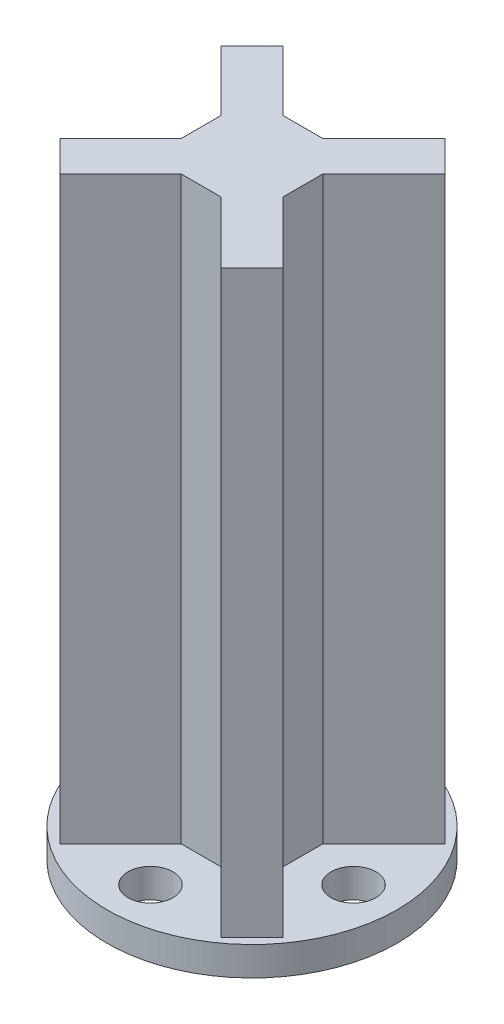
ISO-10303-21;
HEADER;
FILE_DESCRIPTION(('STEP AP214'),'2;1');
FILE_NAME('part.step','',(''),(''),'','','');
FILE_SCHEMA(('AUTOMOTIVE_DESIGN { 1 0 10303 214 1 1 1 1 }'));
ENDSEC;
DATA;
#1=APPLICATION_CONTEXT('core data for automotive mechanical design processes');
#2=APPLICATION_PROTOCOL_DEFINITION('international standard','automotive_design',2000,#1);
#3=PRODUCT_CONTEXT('',#1,'mechanical');
#4=PRODUCT('Part','Part','',(#3));
#5=PRODUCT_RELATED_PRODUCT_CATEGORY('part','',(#4));
#6=PRODUCT_DEFINITION_FORMATION('','',#4);
#7=PRODUCT_DEFINITION_CONTEXT('part definition',#1,'design');
#8=PRODUCT_DEFINITION('design','',#6,#7);
#9=PRODUCT_DEFINITION_SHAPE('','',#8);
#10=(LENGTH_UNIT() NAMED_UNIT(*) SI_UNIT(.MILLI.,.METRE.));
#11=(NAMED_UNIT(*) PLANE_ANGLE_UNIT() SI_UNIT($,.RADIAN.));
#12=(NAMED_UNIT(*) SI_UNIT($,.STERADIAN.) SOLID_ANGLE_UNIT());
#13=UNCERTAINTY_MEASURE_WITH_UNIT(LENGTH_MEASURE(1.E-05),#10,'distance_accuracy_value','');
#14=(GEOMETRIC_REPRESENTATION_CONTEXT(3) GLOBAL_UNCERTAINTY_ASSIGNED_CONTEXT((#13)) GLOBAL_UNIT_ASSIGNED_CONTEXT((#10,
#11,#12)) REPRESENTATION_CONTEXT('',''));
#15=CARTESIAN_POINT('',(0.,0.,0.));
#16=DIRECTION('',(0.,0.,1.));
#17=DIRECTION('',(1.,0.,0.));
#18=AXIS2_PLACEMENT_3D('',#15,#16,#17);
#19=CARTESIAN_POINT('',(0.,-19.,20.99999999999));
#20=DIRECTION('',(0.,1.,5.26164181668953E-13));
#21=DIRECTION('',(1.,0.,0.));
#22=AXIS2_PLACEMENT_3D('',#19,#20,#21);
#23=PLANE('',#22);
#24=DIRECTION('',(0.707106781186547,-3.72054260875587E-13,0.707106781186547));
#25=VECTOR('',#24,1.);
#26=CARTESIAN_POINT('',(3.5,-19.0000000000008,22.3786796564304));
#27=LINE('',#26,#25);
#28=CARTESIAN_POINT('',(3.5,-19.0000000000008,22.3786796564304));
#29=VERTEX_POINT('',#28);
#30=CARTESIAN_POINT('',(7.72465485548361,-19.000000000003,26.603334511914));
#31=VERTEX_POINT('',#30);
#32=EDGE_CURVE('E203',#29,#31,#27,.T.);
#33=ORIENTED_EDGE('',*,*,#32,.T.);
#34=DIRECTION('',(0.707106781186548,3.72054260875587E-13,-0.707106781186547));
#35=VECTOR('',#34,1.);
#36=CARTESIAN_POINT('',(5.60333451192397,-19.0000000000041,28.7246548554736));
#37=LINE('',#36,#35);
#38=CARTESIAN_POINT('',(5.60333451192397,-19.0000000000041,28.7246548554736));
#39=VERTEX_POINT('',#38);
#40=EDGE_CURVE('E207',#39,#31,#37,.T.);
#41=ORIENTED_EDGE('',*,*,#40,.F.);
#42=DIRECTION('',(0.707106781186548,-3.72054260875587E-13,0.707106781186547));
#43=VECTOR('',#42,1.);
#44=CARTESIAN_POINT('',(1.37867965644036,-19.0000000000019,24.49999999999));
#45=LINE('',#44,#43);
#46=CARTESIAN_POINT('',(1.37867965644036,-19.0000000000019,24.49999999999));
#47=VERTEX_POINT('',#46);
#48=EDGE_CURVE('E210',#47,#39,#45,.T.);
#49=ORIENTED_EDGE('',*,*,#48,.F.);
#50=DIRECTION('',(1.,0.,0.));
#51=VECTOR('',#50,1.);
#52=CARTESIAN_POINT('',(-1.37867965644036,-19.0000000000019,24.49999999999));
#53=LINE('',#52,#51);
#54=CARTESIAN_POINT('',(-1.37867965644036,-19.0000000000019,24.49999999999));
#55=VERTEX_POINT('',#54);
#56=EDGE_CURVE('E213',#55,#47,#53,.T.);
#57=ORIENTED_EDGE('',*,*,#56,.F.);
#58=DIRECTION('',(-0.707106781186548,-3.72054260875587E-13,0.707106781186548));
#59=VECTOR('',#58,1.);
#60=CARTESIAN_POINT('',(-1.37867965644036,-19.0000000000019,24.49999999999));
#61=LINE('',#60,#59);
#62=CARTESIAN_POINT('',(-5.56201766710437,-19.0000000000041,28.683338010654));
#63=VERTEX_POINT('',#62);
#64=EDGE_CURVE('E216',#55,#63,#61,.T.);
#65=ORIENTED_EDGE('',*,*,#64,.T.);
#66=DIRECTION('',(0.707106781186547,-3.72054260875587E-13,0.707106781186547));
#67=VECTOR('',#66,1.);
#68=CARTESIAN_POINT('',(-7.68333801066402,-19.000000000003,26.5620176670944));
#69=LINE('',#68,#67);
#70=CARTESIAN_POINT('',(-7.68333801066402,-19.000000000003,26.5620176670944));
#71=VERTEX_POINT('',#70);
#72=EDGE_CURVE('E220',#71,#63,#69,.T.);
#73=ORIENTED_EDGE('',*,*,#72,.F.);
#74=DIRECTION('',(-0.707106781186547,-3.72054260875587E-13,0.707106781186547));
#75=VECTOR('',#74,1.);
#76=CARTESIAN_POINT('',(-3.5,-19.0000000000008,22.3786796564304));
#77=LINE('',#76,#75);
#78=CARTESIAN_POINT('',(-3.5,-19.0000000000008,22.3786796564304));
#79=VERTEX_POINT('',#78);
#80=EDGE_CURVE('E224',#79,#71,#77,.T.);
#81=ORIENTED_EDGE('',*,*,#80,.F.);
#82=DIRECTION('',(0.,5.26164181668953E-13,-1.));
#83=VECTOR('',#82,1.);
#84=CARTESIAN_POINT('',(-3.5,-19.0000000000008,22.3786796564304));
#85=LINE('',#84,#83);
#86=CARTESIAN_POINT('',(-3.5,-18.9999999999993,19.6213203435496));
#87=VERTEX_POINT('',#86);
#88=EDGE_CURVE('E227',#79,#87,#85,.T.);
#89=ORIENTED_EDGE('',*,*,#88,.T.);
#90=DIRECTION('',(-0.707106781186547,3.72054260875587E-13,-0.707106781186547));
#91=VECTOR('',#90,1.);
#92=CARTESIAN_POINT('',(-3.5,-18.9999999999993,19.6213203435496));
#93=LINE('',#92,#91);
#94=CARTESIAN_POINT('',(-7.6416597328646,-18.9999999999971,15.479660610685));
#95=VERTEX_POINT('',#94);
#96=EDGE_CURVE('E231',#87,#95,#93,.T.);
#97=ORIENTED_EDGE('',*,*,#96,.T.);
#98=DIRECTION('',(-0.707106781186548,-3.72054260875587E-13,0.707106781186547));
#99=VECTOR('',#98,1.);
#100=CARTESIAN_POINT('',(-5.52033938930496,-18.999999999996,13.3583402671254));
#101=LINE('',#100,#99);
#102=CARTESIAN_POINT('',(-5.52033938930496,-18.999999999996,13.3583402671254));
#103=VERTEX_POINT('',#102);
#104=EDGE_CURVE('E235',#103,#95,#101,.T.);
#105=ORIENTED_EDGE('',*,*,#104,.F.);
#106=DIRECTION('',(-0.707106781186547,3.72054260875587E-13,-0.707106781186547));
#107=VECTOR('',#106,1.);
#108=CARTESIAN_POINT('',(-1.37867965644036,-18.9999999999982,17.49999999999));
#109=LINE('',#108,#107);
#110=CARTESIAN_POINT('',(-1.37867965644036,-18.9999999999982,17.49999999999));
#111=VERTEX_POINT('',#110);
#112=EDGE_CURVE('E239',#111,#103,#109,.T.);
#113=ORIENTED_EDGE('',*,*,#112,.F.);
#114=DIRECTION('',(1.,0.,0.));
#115=VECTOR('',#114,1.);
#116=CARTESIAN_POINT('',(-1.37867965644036,-18.9999999999982,17.49999999999));
#117=LINE('',#116,#115);
#118=CARTESIAN_POINT('',(1.37867965644036,-18.9999999999982,17.49999999999));
#119=VERTEX_POINT('',#118);
#120=EDGE_CURVE('E242',#111,#119,#117,.T.);
#121=ORIENTED_EDGE('',*,*,#120,.T.);
#122=DIRECTION('',(0.707106781186548,3.72054260875587E-13,-0.707106781186548));
#123=VECTOR('',#122,1.);
#124=CARTESIAN_POINT('',(1.37867965644036,-18.9999999999982,17.49999999999));
#125=LINE('',#124,#123);
#126=CARTESIAN_POINT('',(5.58465948915064,-18.999999999996,13.2940201672797));
#127=VERTEX_POINT('',#126);
#128=EDGE_CURVE('E246',#119,#127,#125,.T.);
#129=ORIENTED_EDGE('',*,*,#128,.T.);
#130=DIRECTION('',(0.707106781186548,-3.72054260875587E-13,0.707106781186548));
#131=VECTOR('',#130,1.);
#132=CARTESIAN_POINT('',(5.58465948915064,-18.999999999996,13.2940201672797));
#133=LINE('',#132,#131);
#134=CARTESIAN_POINT('',(7.70597983271028,-18.9999999999971,15.4153405108394));
#135=VERTEX_POINT('',#134);
#136=EDGE_CURVE('E250',#127,#135,#133,.T.);
#137=ORIENTED_EDGE('',*,*,#136,.T.);
#138=DIRECTION('',(0.707106781186547,3.72054260875587E-13,-0.707106781186548));
#139=VECTOR('',#138,1.);
#140=CARTESIAN_POINT('',(3.5,-18.9999999999993,19.6213203435496));
#141=LINE('',#140,#139);
#142=CARTESIAN_POINT('',(3.5,-18.9999999999993,19.6213203435496));
#143=VERTEX_POINT('',#142);
#144=EDGE_CURVE('E183',#143,#135,#141,.T.);
#145=ORIENTED_EDGE('',*,*,#144,.F.);
#146=DIRECTION('',(0.,5.26164181668953E-13,-1.));
#147=VECTOR('',#146,1.);
#148=CARTESIAN_POINT('',(3.5,-19.0000000000008,22.3786796564304));
#149=LINE('',#148,#147);
#150=EDGE_CURVE('E255',#29,#143,#149,.T.);
#151=ORIENTED_EDGE('',*,*,#150,.F.);
#152=EDGE_LOOP('',(#33,#41,#49,#57,#65,#73,#81,#89,#97,#105,#113,#121,#129,#137,#145,#151));
#153=FACE_BOUND('',#152,.T.);
#154=CARTESIAN_POINT('',(0.,-19.0000000000037,27.99999999999));
#155=DIRECTION('',(0.,1.,5.26164181668953E-13));
#156=DIRECTION('',(1.,0.,0.));
#157=AXIS2_PLACEMENT_3D('',#154,#155,#156);
#158=CIRCLE('',#157,1.55);
#159=CARTESIAN_POINT('',(1.55,-19.0000000000037,27.99999999999));
#160=VERTEX_POINT('',#159);
#161=EDGE_CURVE('E311',#160,#160,#158,.T.);
#162=ORIENTED_EDGE('',*,*,#161,.F.);
#163=EDGE_LOOP('',(#162));
#164=FACE_BOUND('',#163,.T.);
#165=CARTESIAN_POINT('',(0.,-18.9999999999964,13.99999999999));
#166=DIRECTION('',(0.,1.,5.26164181668953E-13));
#167=DIRECTION('',(1.,0.,0.));
#168=AXIS2_PLACEMENT_3D('',#165,#166,#167);
#169=CIRCLE('',#168,1.55);
#170=CARTESIAN_POINT('',(1.55,-18.9999999999964,13.99999999999));
#171=VERTEX_POINT('',#170);
#172=EDGE_CURVE('E327',#171,#171,#169,.T.);
#173=ORIENTED_EDGE('',*,*,#172,.F.);
#174=EDGE_LOOP('',(#173));
#175=FACE_BOUND('',#174,.T.);
#176=CARTESIAN_POINT('',(0.,-19.,20.99999999999));
#177=DIRECTION('',(0.,1.,5.26164181668953E-13));
#178=DIRECTION('',(1.,0.,0.));
#179=AXIS2_PLACEMENT_3D('',#176,#177,#178);
#180=CIRCLE('',#179,10.);
#181=CARTESIAN_POINT('',(10.,-19.,20.99999999999));
#182=VERTEX_POINT('',#181);
#183=EDGE_CURVE('E11',#182,#182,#180,.T.);
#184=ORIENTED_EDGE('',*,*,#183,.T.);
#185=EDGE_LOOP('',(#184));
#186=FACE_BOUND('',#185,.T.);
#187=CARTESIAN_POINT('',(-7.,-19.,20.99999999999));
#188=DIRECTION('',(0.,1.,5.26164181668953E-13));
#189=DIRECTION('',(1.,0.,0.));
#190=AXIS2_PLACEMENT_3D('',#187,#188,#189);
#191=CIRCLE('',#190,1.55);
#192=CARTESIAN_POINT('',(-5.45,-19.,20.99999999999));
#193=VERTEX_POINT('',#192);
#194=EDGE_CURVE('E319',#193,#193,#191,.T.);
#195=ORIENTED_EDGE('',*,*,#194,.F.);
#196=EDGE_LOOP('',(#195));
#197=FACE_BOUND('',#196,.T.);
#198=CARTESIAN_POINT('',(7.,-19.,20.99999999999));
#199=DIRECTION('',(0.,1.,5.26164181668953E-13));
#200=DIRECTION('',(1.,0.,0.));
#201=AXIS2_PLACEMENT_3D('',#198,#199,#200);
#202=CIRCLE('',#201,1.55);
#203=CARTESIAN_POINT('',(8.55,-19.,20.99999999999));
#204=VERTEX_POINT('',#203);
#205=EDGE_CURVE('E303',#204,#204,#202,.T.);
#206=ORIENTED_EDGE('',*,*,#205,.F.);
#207=EDGE_LOOP('',(#206));
#208=FACE_BOUND('',#207,.T.);
#209=ADVANCED_FACE('F45',(#153,#164,#175,#186,#197,#208),#23,.T.);
#210=CARTESIAN_POINT('',(0.,-21.,20.9999999999889));
#211=DIRECTION('',(0.,1.,5.26164181668953E-13));
#212=DIRECTION('',(1.,0.,0.));
#213=AXIS2_PLACEMENT_3D('',#210,#211,#212);
#214=PLANE('',#213);
#215=CARTESIAN_POINT('',(0.,-21.,20.9999999999889));
#216=DIRECTION('',(0.,1.,5.26164181668953E-13));
#217=DIRECTION('',(1.,0.,0.));
#218=AXIS2_PLACEMENT_3D('',#215,#216,#217);
#219=CIRCLE('',#218,10.);
#220=CARTESIAN_POINT('',(10.,-21.,20.9999999999889));
#221=VERTEX_POINT('',#220);
#222=EDGE_CURVE('E49',#221,#221,#219,.T.);
#223=ORIENTED_EDGE('',*,*,#222,.F.);
#224=EDGE_LOOP('',(#223));
#225=FACE_BOUND('',#224,.T.);
#226=CARTESIAN_POINT('',(0.,-20.9999999999963,13.9999999999889));
#227=DIRECTION('',(0.,1.,5.26164181668953E-13));
#228=DIRECTION('',(1.,0.,0.));
#229=AXIS2_PLACEMENT_3D('',#226,#227,#228);
#230=CIRCLE('',#229,1.55);
#231=CARTESIAN_POINT('',(1.55,-20.9999999999963,13.9999999999889));
#232=VERTEX_POINT('',#231);
#233=EDGE_CURVE('E323',#232,#232,#230,.T.);
#234=ORIENTED_EDGE('',*,*,#233,.T.);
#235=EDGE_LOOP('',(#234));
#236=FACE_BOUND('',#235,.T.);
#237=CARTESIAN_POINT('',(-7.,-21.,20.999999999989));
#238=DIRECTION('',(0.,1.,5.26164181668953E-13));
#239=DIRECTION('',(1.,0.,0.));
#240=AXIS2_PLACEMENT_3D('',#237,#238,#239);
#241=CIRCLE('',#240,1.55);
#242=CARTESIAN_POINT('',(-5.45,-21.,20.999999999989));
#243=VERTEX_POINT('',#242);
#244=EDGE_CURVE('E315',#243,#243,#241,.T.);
#245=ORIENTED_EDGE('',*,*,#244,.T.);
#246=EDGE_LOOP('',(#245));
#247=FACE_BOUND('',#246,.T.);
#248=CARTESIAN_POINT('',(0.,-21.0000000000037,27.9999999999889));
#249=DIRECTION('',(0.,1.,5.26164181668953E-13));
#250=DIRECTION('',(1.,0.,0.));
#251=AXIS2_PLACEMENT_3D('',#248,#249,#250);
#252=CIRCLE('',#251,1.55);
#253=CARTESIAN_POINT('',(1.55,-21.0000000000037,27.9999999999889));
#254=VERTEX_POINT('',#253);
#255=EDGE_CURVE('E307',#254,#254,#252,.T.);
#256=ORIENTED_EDGE('',*,*,#255,.T.);
#257=EDGE_LOOP('',(#256));
#258=FACE_BOUND('',#257,.T.);
#259=CARTESIAN_POINT('',(7.,-21.,20.9999999999889));
#260=DIRECTION('',(0.,1.,5.26164181668953E-13));
#261=DIRECTION('',(1.,0.,0.));
#262=AXIS2_PLACEMENT_3D('',#259,#260,#261);
#263=CIRCLE('',#262,1.55);
#264=CARTESIAN_POINT('',(8.55,-21.,20.9999999999889));
#265=VERTEX_POINT('',#264);
#266=EDGE_CURVE('E261',#265,#265,#263,.T.);
#267=ORIENTED_EDGE('',*,*,#266,.T.);
#268=EDGE_LOOP('',(#267));
#269=FACE_BOUND('',#268,.T.);
#270=ADVANCED_FACE('F335',(#225,#236,#247,#258,#269),#214,.F.);
#271=CARTESIAN_POINT('',(0.,-19.,20.99999999999));
#272=DIRECTION('',(0.,-1.,-5.26164181668953E-13));
#273=DIRECTION('',(-1.,0.,0.));
#274=AXIS2_PLACEMENT_3D('',#271,#272,#273);
#275=CYLINDRICAL_SURFACE('',#274,10.);
#276=ORIENTED_EDGE('',*,*,#183,.F.);
#277=EDGE_LOOP('',(#276));
#278=FACE_BOUND('',#277,.T.);
#279=ORIENTED_EDGE('',*,*,#222,.T.);
#280=EDGE_LOOP('',(#279));
#281=FACE_BOUND('',#280,.T.);
#282=ADVANCED_FACE('F47',(#278,#281),#275,.T.);
#283=CARTESIAN_POINT('',(0.,-18.9999999999964,13.99999999999));
#284=DIRECTION('',(0.,-1.,-5.26164181668953E-13));
#285=DIRECTION('',(-1.,0.,0.));
#286=AXIS2_PLACEMENT_3D('',#283,#284,#285);
#287=CYLINDRICAL_SURFACE('',#286,1.55);
#288=ORIENTED_EDGE('',*,*,#172,.T.);
#289=EDGE_LOOP('',(#288));
#290=FACE_BOUND('',#289,.T.);
#291=ORIENTED_EDGE('',*,*,#233,.F.);
#292=EDGE_LOOP('',(#291));
#293=FACE_BOUND('',#292,.T.);
#294=ADVANCED_FACE('F338',(#290,#293),#287,.F.);
#295=CARTESIAN_POINT('',(-7.,-19.,20.99999999999));
#296=DIRECTION('',(0.,-1.,-5.26164181668953E-13));
#297=DIRECTION('',(-1.,0.,0.));
#298=AXIS2_PLACEMENT_3D('',#295,#296,#297);
#299=CYLINDRICAL_SURFACE('',#298,1.55);
#300=ORIENTED_EDGE('',*,*,#194,.T.);
#301=EDGE_LOOP('',(#300));
#302=FACE_BOUND('',#301,.T.);
#303=ORIENTED_EDGE('',*,*,#244,.F.);
#304=EDGE_LOOP('',(#303));
#305=FACE_BOUND('',#304,.T.);
#306=ADVANCED_FACE('F340',(#302,#305),#299,.F.);
#307=CARTESIAN_POINT('',(0.,-19.0000000000037,27.99999999999));
#308=DIRECTION('',(0.,-1.,-5.26164181668953E-13));
#309=DIRECTION('',(-1.,0.,0.));
#310=AXIS2_PLACEMENT_3D('',#307,#308,#309);
#311=CYLINDRICAL_SURFACE('',#310,1.55);
#312=ORIENTED_EDGE('',*,*,#161,.T.);
#313=EDGE_LOOP('',(#312));
#314=FACE_BOUND('',#313,.T.);
#315=ORIENTED_EDGE('',*,*,#255,.F.);
#316=EDGE_LOOP('',(#315));
#317=FACE_BOUND('',#316,.T.);
#318=ADVANCED_FACE('F347',(#314,#317),#311,.F.);
#319=CARTESIAN_POINT('',(7.,-19.,20.99999999999));
#320=DIRECTION('',(0.,-1.,-5.26164181668953E-13));
#321=DIRECTION('',(-1.,0.,0.));
#322=AXIS2_PLACEMENT_3D('',#319,#320,#321);
#323=CYLINDRICAL_SURFACE('',#322,1.55);
#324=ORIENTED_EDGE('',*,*,#205,.T.);
#325=EDGE_LOOP('',(#324));
#326=FACE_BOUND('',#325,.T.);
#327=ORIENTED_EDGE('',*,*,#266,.F.);
#328=EDGE_LOOP('',(#327));
#329=FACE_BOUND('',#328,.T.);
#330=ADVANCED_FACE('F371',(#326,#329),#323,.F.);
#331=CARTESIAN_POINT('',(3.5,20.9999999999992,22.3786796564514));
#332=DIRECTION('',(0.707106781186548,3.72054260875587E-13,-0.707106781186548));
#333=DIRECTION('',(-0.707106781186548,3.72054260875587E-13,-0.707106781186548));
#334=AXIS2_PLACEMENT_3D('',#331,#332,#333);
#335=PLANE('',#334);
#336=ORIENTED_EDGE('',*,*,#32,.F.);
#337=DIRECTION('',(0.,-1.,-5.26164181668953E-13));
#338=VECTOR('',#337,1.);
#339=CARTESIAN_POINT('',(3.5,20.9999999999992,22.3786796564514));
#340=LINE('',#339,#338);
#341=CARTESIAN_POINT('',(3.5,20.9999999999992,22.3786796564514));
#342=VERTEX_POINT('',#341);
#343=EDGE_CURVE('E70',#342,#29,#340,.T.);
#344=ORIENTED_EDGE('',*,*,#343,.F.);
#345=DIRECTION('',(0.707106781186547,-3.72054260875587E-13,0.707106781186547));
#346=VECTOR('',#345,1.);
#347=CARTESIAN_POINT('',(3.5,20.9999999999992,22.3786796564514));
#348=LINE('',#347,#346);
#349=CARTESIAN_POINT('',(7.72465485548361,20.999999999997,26.603334511935));
#350=VERTEX_POINT('',#349);
#351=EDGE_CURVE('E258',#342,#350,#348,.T.);
#352=ORIENTED_EDGE('',*,*,#351,.T.);
#353=DIRECTION('',(0.,-1.,-5.26164181668953E-13));
#354=VECTOR('',#353,1.);
#355=CARTESIAN_POINT('',(7.72465485548361,20.999999999997,26.603334511935));
#356=LINE('',#355,#354);
#357=EDGE_CURVE('E202',#350,#31,#356,.T.);
#358=ORIENTED_EDGE('',*,*,#357,.T.);
#359=EDGE_LOOP('',(#336,#344,#352,#358));
#360=FACE_BOUND('',#359,.T.);
#361=ADVANCED_FACE('F374',(#360),#335,.T.);
#362=CARTESIAN_POINT('',(3.5,20.9999999999992,22.3786796564514));
#363=DIRECTION('',(-1.,0.,0.));
#364=DIRECTION('',(0.,-5.26164181668953E-13,1.));
#365=AXIS2_PLACEMENT_3D('',#362,#363,#364);
#366=PLANE('',#365);
#367=ORIENTED_EDGE('',*,*,#150,.T.);
#368=DIRECTION('',(0.,-1.,-5.26164181668953E-13));
#369=VECTOR('',#368,1.);
#370=CARTESIAN_POINT('',(3.5,21.0000000000007,19.6213203435707));
#371=LINE('',#370,#369);
#372=CARTESIAN_POINT('',(3.5,21.0000000000007,19.6213203435707));
#373=VERTEX_POINT('',#372);
#374=EDGE_CURVE('E188',#373,#143,#371,.T.);
#375=ORIENTED_EDGE('',*,*,#374,.F.);
#376=DIRECTION('',(0.,5.26164181668953E-13,-1.));
#377=VECTOR('',#376,1.);
#378=CARTESIAN_POINT('',(3.5,20.9999999999992,22.3786796564514));
#379=LINE('',#378,#377);
#380=EDGE_CURVE('E173',#342,#373,#379,.T.);
#381=ORIENTED_EDGE('',*,*,#380,.F.);
#382=ORIENTED_EDGE('',*,*,#343,.T.);
#383=EDGE_LOOP('',(#367,#375,#381,#382));
#384=FACE_BOUND('',#383,.T.);
#385=ADVANCED_FACE('F382',(#384),#366,.F.);
#386=CARTESIAN_POINT('',(3.5,21.0000000000007,19.6213203435707));
#387=DIRECTION('',(-0.707106781186548,3.72054260875587E-13,-0.707106781186547));
#388=DIRECTION('',(-0.707106781186547,-3.72054260875587E-13,0.707106781186548));
#389=AXIS2_PLACEMENT_3D('',#386,#387,#388);
#390=PLANE('',#389);
#391=ORIENTED_EDGE('',*,*,#144,.T.);
#392=DIRECTION('',(0.,-1.,-5.26164181668953E-13));
#393=VECTOR('',#392,1.);
#394=CARTESIAN_POINT('',(7.70597983271028,21.0000000000029,15.4153405108604));
#395=LINE('',#394,#393);
#396=CARTESIAN_POINT('',(7.70597983271028,21.0000000000029,15.4153405108604));
#397=VERTEX_POINT('',#396);
#398=EDGE_CURVE('E180',#397,#135,#395,.T.);
#399=ORIENTED_EDGE('',*,*,#398,.F.);
#400=DIRECTION('',(0.707106781186547,3.72054260875587E-13,-0.707106781186548));
#401=VECTOR('',#400,1.);
#402=CARTESIAN_POINT('',(3.5,21.0000000000007,19.6213203435707));
#403=LINE('',#402,#401);
#404=EDGE_CURVE('E166',#373,#397,#403,.T.);
#405=ORIENTED_EDGE('',*,*,#404,.F.);
#406=ORIENTED_EDGE('',*,*,#374,.T.);
#407=EDGE_LOOP('',(#391,#399,#405,#406));
#408=FACE_BOUND('',#407,.T.);
#409=ADVANCED_FACE('F181',(#408),#390,.F.);
#410=CARTESIAN_POINT('',(5.58465948915064,21.000000000004,13.2940201673008));
#411=DIRECTION('',(0.707106781186548,3.72054260875587E-13,-0.707106781186548));
#412=DIRECTION('',(-0.707106781186548,3.72054260875587E-13,-0.707106781186548));
#413=AXIS2_PLACEMENT_3D('',#410,#411,#412);
#414=PLANE('',#413);
#415=ORIENTED_EDGE('',*,*,#136,.F.);
#416=DIRECTION('',(0.,-1.,-5.26164181668953E-13));
#417=VECTOR('',#416,1.);
#418=CARTESIAN_POINT('',(5.58465948915064,21.000000000004,13.2940201673008));
#419=LINE('',#418,#417);
#420=CARTESIAN_POINT('',(5.58465948915064,21.000000000004,13.2940201673008));
#421=VERTEX_POINT('',#420);
#422=EDGE_CURVE('E189',#421,#127,#419,.T.);
#423=ORIENTED_EDGE('',*,*,#422,.F.);
#424=DIRECTION('',(0.707106781186548,-3.72054260875587E-13,0.707106781186548));
#425=VECTOR('',#424,1.);
#426=CARTESIAN_POINT('',(5.58465948915064,21.000000000004,13.2940201673008));
#427=LINE('',#426,#425);
#428=EDGE_CURVE('E171',#421,#397,#427,.T.);
#429=ORIENTED_EDGE('',*,*,#428,.T.);
#430=ORIENTED_EDGE('',*,*,#398,.T.);
#431=EDGE_LOOP('',(#415,#423,#429,#430));
#432=FACE_BOUND('',#431,.T.);
#433=ADVANCED_FACE('F191',(#432),#414,.T.);
#434=CARTESIAN_POINT('',(1.37867965644036,21.0000000000018,17.500000000011));
#435=DIRECTION('',(-0.707106781186548,3.72054260875587E-13,-0.707106781186548));
#436=DIRECTION('',(-0.707106781186548,-3.72054260875587E-13,0.707106781186548));
#437=AXIS2_PLACEMENT_3D('',#434,#435,#436);
#438=PLANE('',#437);
#439=ORIENTED_EDGE('',*,*,#128,.F.);
#440=DIRECTION('',(0.,-1.,-5.26164181668953E-13));
#441=VECTOR('',#440,1.);
#442=CARTESIAN_POINT('',(1.37867965644036,21.0000000000018,17.500000000011));
#443=LINE('',#442,#441);
#444=CARTESIAN_POINT('',(1.37867965644036,21.0000000000018,17.500000000011));
#445=VERTEX_POINT('',#444);
#446=EDGE_CURVE('E266',#445,#119,#443,.T.);
#447=ORIENTED_EDGE('',*,*,#446,.F.);
#448=DIRECTION('',(0.707106781186548,3.72054260875587E-13,-0.707106781186548));
#449=VECTOR('',#448,1.);
#450=CARTESIAN_POINT('',(1.37867965644036,21.0000000000018,17.500000000011));
#451=LINE('',#450,#449);
#452=EDGE_CURVE('E193',#445,#421,#451,.T.);
#453=ORIENTED_EDGE('',*,*,#452,.T.);
#454=ORIENTED_EDGE('',*,*,#422,.T.);
#455=EDGE_LOOP('',(#439,#447,#453,#454));
#456=FACE_BOUND('',#455,.T.);
#457=ADVANCED_FACE('F429',(#456),#438,.T.);
#458=CARTESIAN_POINT('',(-1.37867965644036,21.0000000000018,17.500000000011));
#459=DIRECTION('',(0.,5.26164181668953E-13,-1.));
#460=DIRECTION('',(-1.,0.,0.));
#461=AXIS2_PLACEMENT_3D('',#458,#459,#460);
#462=PLANE('',#461);
#463=ORIENTED_EDGE('',*,*,#120,.F.);
#464=DIRECTION('',(0.,-1.,-5.26164181668953E-13));
#465=VECTOR('',#464,1.);
#466=CARTESIAN_POINT('',(-1.37867965644036,21.0000000000018,17.500000000011));
#467=LINE('',#466,#465);
#468=CARTESIAN_POINT('',(-1.37867965644036,21.0000000000018,17.500000000011));
#469=VERTEX_POINT('',#468);
#470=EDGE_CURVE('E269',#469,#111,#467,.T.);
#471=ORIENTED_EDGE('',*,*,#470,.F.);
#472=DIRECTION('',(1.,0.,0.));
#473=VECTOR('',#472,1.);
#474=CARTESIAN_POINT('',(-1.37867965644036,21.0000000000018,17.500000000011));
#475=LINE('',#474,#473);
#476=EDGE_CURVE('E196',#469,#445,#475,.T.);
#477=ORIENTED_EDGE('',*,*,#476,.T.);
#478=ORIENTED_EDGE('',*,*,#446,.T.);
#479=EDGE_LOOP('',(#463,#471,#477,#478));
#480=FACE_BOUND('',#479,.T.);
#481=ADVANCED_FACE('F425',(#480),#462,.T.);
#482=CARTESIAN_POINT('',(-1.37867965644036,21.0000000000018,17.500000000011));
#483=DIRECTION('',(-0.707106781186548,-3.72054260875587E-13,0.707106781186548));
#484=DIRECTION('',(0.707106781186548,-3.72054260875587E-13,0.707106781186548));
#485=AXIS2_PLACEMENT_3D('',#482,#483,#484);
#486=PLANE('',#485);
#487=ORIENTED_EDGE('',*,*,#112,.T.);
#488=DIRECTION('',(0.,-1.,-5.26164181668953E-13));
#489=VECTOR('',#488,1.);
#490=CARTESIAN_POINT('',(-5.52033938930496,21.000000000004,13.3583402671465));
#491=LINE('',#490,#489);
#492=CARTESIAN_POINT('',(-5.52033938930496,21.000000000004,13.3583402671465));
#493=VERTEX_POINT('',#492);
#494=EDGE_CURVE('E272',#493,#103,#491,.T.);
#495=ORIENTED_EDGE('',*,*,#494,.F.);
#496=DIRECTION('',(-0.707106781186547,3.72054260875587E-13,-0.707106781186547));
#497=VECTOR('',#496,1.);
#498=CARTESIAN_POINT('',(-1.37867965644036,21.0000000000018,17.500000000011));
#499=LINE('',#498,#497);
#500=EDGE_CURVE('E586',#469,#493,#499,.T.);
#501=ORIENTED_EDGE('',*,*,#500,.F.);
#502=ORIENTED_EDGE('',*,*,#470,.T.);
#503=EDGE_LOOP('',(#487,#495,#501,#502));
#504=FACE_BOUND('',#503,.T.);
#505=ADVANCED_FACE('F421',(#504),#486,.F.);
#506=CARTESIAN_POINT('',(-5.52033938930496,21.000000000004,13.3583402671465));
#507=DIRECTION('',(0.707106781186547,-3.72054260875587E-13,0.707106781186548));
#508=DIRECTION('',(0.707106781186548,3.72054260875587E-13,-0.707106781186547));
#509=AXIS2_PLACEMENT_3D('',#506,#507,#508);
#510=PLANE('',#509);
#511=ORIENTED_EDGE('',*,*,#104,.T.);
#512=DIRECTION('',(0.,-1.,-5.26164181668953E-13));
#513=VECTOR('',#512,1.);
#514=CARTESIAN_POINT('',(-7.6416597328646,21.0000000000029,15.4796606107061));
#515=LINE('',#514,#513);
#516=CARTESIAN_POINT('',(-7.6416597328646,21.0000000000029,15.4796606107061));
#517=VERTEX_POINT('',#516);
#518=EDGE_CURVE('E276',#517,#95,#515,.T.);
#519=ORIENTED_EDGE('',*,*,#518,.F.);
#520=DIRECTION('',(-0.707106781186548,-3.72054260875587E-13,0.707106781186547));
#521=VECTOR('',#520,1.);
#522=CARTESIAN_POINT('',(-5.52033938930496,21.000000000004,13.3583402671465));
#523=LINE('',#522,#521);
#524=EDGE_CURVE('E588',#493,#517,#523,.T.);
#525=ORIENTED_EDGE('',*,*,#524,.F.);
#526=ORIENTED_EDGE('',*,*,#494,.T.);
#527=EDGE_LOOP('',(#511,#519,#525,#526));
#528=FACE_BOUND('',#527,.T.);
#529=ADVANCED_FACE('F417',(#528),#510,.F.);
#530=CARTESIAN_POINT('',(-3.5,21.0000000000007,19.6213203435707));
#531=DIRECTION('',(-0.707106781186548,-3.72054260875587E-13,0.707106781186548));
#532=DIRECTION('',(0.707106781186548,-3.72054260875587E-13,0.707106781186548));
#533=AXIS2_PLACEMENT_3D('',#530,#531,#532);
#534=PLANE('',#533);
#535=ORIENTED_EDGE('',*,*,#96,.F.);
#536=DIRECTION('',(0.,-1.,-5.26164181668953E-13));
#537=VECTOR('',#536,1.);
#538=CARTESIAN_POINT('',(-3.5,21.0000000000007,19.6213203435707));
#539=LINE('',#538,#537);
#540=CARTESIAN_POINT('',(-3.5,21.0000000000007,19.6213203435707));
#541=VERTEX_POINT('',#540);
#542=EDGE_CURVE('E279',#541,#87,#539,.T.);
#543=ORIENTED_EDGE('',*,*,#542,.F.);
#544=DIRECTION('',(-0.707106781186547,3.72054260875587E-13,-0.707106781186547));
#545=VECTOR('',#544,1.);
#546=CARTESIAN_POINT('',(-3.5,21.0000000000007,19.6213203435707));
#547=LINE('',#546,#545);
#548=EDGE_CURVE('E593',#541,#517,#547,.T.);
#549=ORIENTED_EDGE('',*,*,#548,.T.);
#550=ORIENTED_EDGE('',*,*,#518,.T.);
#551=EDGE_LOOP('',(#535,#543,#549,#550));
#552=FACE_BOUND('',#551,.T.);
#553=ADVANCED_FACE('F413',(#552),#534,.T.);
#554=CARTESIAN_POINT('',(-3.5,20.9999999999992,22.3786796564514));
#555=DIRECTION('',(-1.,0.,0.));
#556=DIRECTION('',(0.,1.,5.26164181668953E-13));
#557=AXIS2_PLACEMENT_3D('',#554,#555,#556);
#558=PLANE('',#557);
#559=ORIENTED_EDGE('',*,*,#88,.F.);
#560=DIRECTION('',(0.,-1.,-5.26164181668953E-13));
#561=VECTOR('',#560,1.);
#562=CARTESIAN_POINT('',(-3.5,20.9999999999992,22.3786796564514));
#563=LINE('',#562,#561);
#564=CARTESIAN_POINT('',(-3.5,20.9999999999992,22.3786796564514));
#565=VERTEX_POINT('',#564);
#566=EDGE_CURVE('E282',#565,#79,#563,.T.);
#567=ORIENTED_EDGE('',*,*,#566,.F.);
#568=DIRECTION('',(0.,5.26164181668953E-13,-1.));
#569=VECTOR('',#568,1.);
#570=CARTESIAN_POINT('',(-3.5,20.9999999999992,22.3786796564514));
#571=LINE('',#570,#569);
#572=EDGE_CURVE('E597',#565,#541,#571,.T.);
#573=ORIENTED_EDGE('',*,*,#572,.T.);
#574=ORIENTED_EDGE('',*,*,#542,.T.);
#575=EDGE_LOOP('',(#559,#567,#573,#574));
#576=FACE_BOUND('',#575,.T.);
#577=ADVANCED_FACE('F409',(#576),#558,.T.);
#578=CARTESIAN_POINT('',(-3.5,20.9999999999992,22.3786796564514));
#579=DIRECTION('',(0.707106781186548,-3.72054260875587E-13,0.707106781186548));
#580=DIRECTION('',(0.707106781186548,3.72054260875587E-13,-0.707106781186548));
#581=AXIS2_PLACEMENT_3D('',#578,#579,#580);
#582=PLANE('',#581);
#583=ORIENTED_EDGE('',*,*,#80,.T.);
#584=DIRECTION('',(0.,-1.,-5.26164181668953E-13));
#585=VECTOR('',#584,1.);
#586=CARTESIAN_POINT('',(-7.68333801066402,20.999999999997,26.5620176671154));
#587=LINE('',#586,#585);
#588=CARTESIAN_POINT('',(-7.68333801066402,20.999999999997,26.5620176671154));
#589=VERTEX_POINT('',#588);
#590=EDGE_CURVE('E285',#589,#71,#587,.T.);
#591=ORIENTED_EDGE('',*,*,#590,.F.);
#592=DIRECTION('',(-0.707106781186547,-3.72054260875587E-13,0.707106781186547));
#593=VECTOR('',#592,1.);
#594=CARTESIAN_POINT('',(-3.5,20.9999999999992,22.3786796564514));
#595=LINE('',#594,#593);
#596=EDGE_CURVE('E601',#565,#589,#595,.T.);
#597=ORIENTED_EDGE('',*,*,#596,.F.);
#598=ORIENTED_EDGE('',*,*,#566,.T.);
#599=EDGE_LOOP('',(#583,#591,#597,#598));
#600=FACE_BOUND('',#599,.T.);
#601=ADVANCED_FACE('F405',(#600),#582,.F.);
#602=CARTESIAN_POINT('',(-7.68333801066402,20.999999999997,26.5620176671154));
#603=DIRECTION('',(0.707106781186548,3.72054260875587E-13,-0.707106781186548));
#604=DIRECTION('',(-0.707106781186548,3.72054260875587E-13,-0.707106781186548));
#605=AXIS2_PLACEMENT_3D('',#602,#603,#604);
#606=PLANE('',#605);
#607=ORIENTED_EDGE('',*,*,#72,.T.);
#608=DIRECTION('',(0.,-1.,-5.26164181668953E-13));
#609=VECTOR('',#608,1.);
#610=CARTESIAN_POINT('',(-5.56201766710437,20.9999999999959,28.6833380106751));
#611=LINE('',#610,#609);
#612=CARTESIAN_POINT('',(-5.56201766710437,20.9999999999959,28.6833380106751));
#613=VERTEX_POINT('',#612);
#614=EDGE_CURVE('E289',#613,#63,#611,.T.);
#615=ORIENTED_EDGE('',*,*,#614,.F.);
#616=DIRECTION('',(0.707106781186547,-3.72054260875587E-13,0.707106781186547));
#617=VECTOR('',#616,1.);
#618=CARTESIAN_POINT('',(-7.68333801066402,20.999999999997,26.5620176671154));
#619=LINE('',#618,#617);
#620=EDGE_CURVE('E604',#589,#613,#619,.T.);
#621=ORIENTED_EDGE('',*,*,#620,.F.);
#622=ORIENTED_EDGE('',*,*,#590,.T.);
#623=EDGE_LOOP('',(#607,#615,#621,#622));
#624=FACE_BOUND('',#623,.T.);
#625=ADVANCED_FACE('F401',(#624),#606,.F.);
#626=CARTESIAN_POINT('',(-1.37867965644036,20.9999999999981,24.500000000011));
#627=DIRECTION('',(0.707106781186548,-3.72054260875587E-13,0.707106781186548));
#628=DIRECTION('',(0.707106781186548,3.72054260875587E-13,-0.707106781186548));
#629=AXIS2_PLACEMENT_3D('',#626,#627,#628);
#630=PLANE('',#629);
#631=ORIENTED_EDGE('',*,*,#64,.F.);
#632=DIRECTION('',(0.,-1.,-5.26164181668953E-13));
#633=VECTOR('',#632,1.);
#634=CARTESIAN_POINT('',(-1.37867965644036,20.9999999999981,24.500000000011));
#635=LINE('',#634,#633);
#636=CARTESIAN_POINT('',(-1.37867965644036,20.9999999999981,24.500000000011));
#637=VERTEX_POINT('',#636);
#638=EDGE_CURVE('E292',#637,#55,#635,.T.);
#639=ORIENTED_EDGE('',*,*,#638,.F.);
#640=DIRECTION('',(-0.707106781186548,-3.72054260875587E-13,0.707106781186548));
#641=VECTOR('',#640,1.);
#642=CARTESIAN_POINT('',(-1.37867965644036,20.9999999999981,24.500000000011));
#643=LINE('',#642,#641);
#644=EDGE_CURVE('E607',#637,#613,#643,.T.);
#645=ORIENTED_EDGE('',*,*,#644,.T.);
#646=ORIENTED_EDGE('',*,*,#614,.T.);
#647=EDGE_LOOP('',(#631,#639,#645,#646));
#648=FACE_BOUND('',#647,.T.);
#649=ADVANCED_FACE('F397',(#648),#630,.T.);
#650=CARTESIAN_POINT('',(-1.37867965644036,20.9999999999981,24.500000000011));
#651=DIRECTION('',(0.,5.26164181668953E-13,-1.));
#652=DIRECTION('',(-1.,0.,0.));
#653=AXIS2_PLACEMENT_3D('',#650,#651,#652);
#654=PLANE('',#653);
#655=ORIENTED_EDGE('',*,*,#56,.T.);
#656=DIRECTION('',(0.,-1.,-5.26164181668953E-13));
#657=VECTOR('',#656,1.);
#658=CARTESIAN_POINT('',(1.37867965644036,20.9999999999981,24.500000000011));
#659=LINE('',#658,#657);
#660=CARTESIAN_POINT('',(1.37867965644036,20.9999999999981,24.500000000011));
#661=VERTEX_POINT('',#660);
#662=EDGE_CURVE('E295',#661,#47,#659,.T.);
#663=ORIENTED_EDGE('',*,*,#662,.F.);
#664=DIRECTION('',(1.,0.,0.));
#665=VECTOR('',#664,1.);
#666=CARTESIAN_POINT('',(-1.37867965644036,20.9999999999981,24.500000000011));
#667=LINE('',#666,#665);
#668=EDGE_CURVE('E611',#637,#661,#667,.T.);
#669=ORIENTED_EDGE('',*,*,#668,.F.);
#670=ORIENTED_EDGE('',*,*,#638,.T.);
#671=EDGE_LOOP('',(#655,#663,#669,#670));
#672=FACE_BOUND('',#671,.T.);
#673=ADVANCED_FACE('F393',(#672),#654,.F.);
#674=CARTESIAN_POINT('',(1.37867965644036,20.9999999999981,24.500000000011));
#675=DIRECTION('',(0.707106781186547,3.72054260875588E-13,-0.707106781186548));
#676=DIRECTION('',(-0.707106781186548,3.72054260875587E-13,-0.707106781186547));
#677=AXIS2_PLACEMENT_3D('',#674,#675,#676);
#678=PLANE('',#677);
#679=ORIENTED_EDGE('',*,*,#48,.T.);
#680=DIRECTION('',(0.,-1.,-5.26164181668953E-13));
#681=VECTOR('',#680,1.);
#682=CARTESIAN_POINT('',(5.60333451192397,20.9999999999959,28.7246548554947));
#683=LINE('',#682,#681);
#684=CARTESIAN_POINT('',(5.60333451192397,20.9999999999959,28.7246548554947));
#685=VERTEX_POINT('',#684);
#686=EDGE_CURVE('E61',#685,#39,#683,.T.);
#687=ORIENTED_EDGE('',*,*,#686,.F.);
#688=DIRECTION('',(0.707106781186548,-3.72054260875587E-13,0.707106781186547));
#689=VECTOR('',#688,1.);
#690=CARTESIAN_POINT('',(1.37867965644036,20.9999999999981,24.500000000011));
#691=LINE('',#690,#689);
#692=EDGE_CURVE('E614',#661,#685,#691,.T.);
#693=ORIENTED_EDGE('',*,*,#692,.F.);
#694=ORIENTED_EDGE('',*,*,#662,.T.);
#695=EDGE_LOOP('',(#679,#687,#693,#694));
#696=FACE_BOUND('',#695,.T.);
#697=ADVANCED_FACE('F390',(#696),#678,.F.);
#698=CARTESIAN_POINT('',(5.60333451192397,20.9999999999959,28.7246548554947));
#699=DIRECTION('',(-0.707106781186547,3.72054260875587E-13,-0.707106781186548));
#700=DIRECTION('',(-0.707106781186548,-3.72054260875587E-13,0.707106781186547));
#701=AXIS2_PLACEMENT_3D('',#698,#699,#700);
#702=PLANE('',#701);
#703=ORIENTED_EDGE('',*,*,#40,.T.);
#704=ORIENTED_EDGE('',*,*,#357,.F.);
#705=DIRECTION('',(0.707106781186548,3.72054260875587E-13,-0.707106781186547));
#706=VECTOR('',#705,1.);
#707=CARTESIAN_POINT('',(5.60333451192397,20.9999999999959,28.7246548554947));
#708=LINE('',#707,#706);
#709=EDGE_CURVE('E127',#685,#350,#708,.T.);
#710=ORIENTED_EDGE('',*,*,#709,.F.);
#711=ORIENTED_EDGE('',*,*,#686,.T.);
#712=EDGE_LOOP('',(#703,#704,#710,#711));
#713=FACE_BOUND('',#712,.T.);
#714=ADVANCED_FACE('F387',(#713),#702,.F.);
#715=CARTESIAN_POINT('',(0.,21.,21.000000000011));
#716=DIRECTION('',(0.,1.,5.26164181668953E-13));
#717=DIRECTION('',(1.,0.,0.));
#718=AXIS2_PLACEMENT_3D('',#715,#716,#717);
#719=PLANE('',#718);
#720=ORIENTED_EDGE('',*,*,#351,.F.);
#721=ORIENTED_EDGE('',*,*,#380,.T.);
#722=ORIENTED_EDGE('',*,*,#404,.T.);
#723=ORIENTED_EDGE('',*,*,#428,.F.);
#724=ORIENTED_EDGE('',*,*,#452,.F.);
#725=ORIENTED_EDGE('',*,*,#476,.F.);
#726=ORIENTED_EDGE('',*,*,#500,.T.);
#727=ORIENTED_EDGE('',*,*,#524,.T.);
#728=ORIENTED_EDGE('',*,*,#548,.F.);
#729=ORIENTED_EDGE('',*,*,#572,.F.);
#730=ORIENTED_EDGE('',*,*,#596,.T.);
#731=ORIENTED_EDGE('',*,*,#620,.T.);
#732=ORIENTED_EDGE('',*,*,#644,.F.);
#733=ORIENTED_EDGE('',*,*,#668,.T.);
#734=ORIENTED_EDGE('',*,*,#692,.T.);
#735=ORIENTED_EDGE('',*,*,#709,.T.);
#736=EDGE_LOOP('',(#720,#721,#722,#723,#724,#725,#726,#727,#728,#729,#730,#731,#732,#733,#734,#735));
#737=FACE_BOUND('',#736,.T.);
#738=ADVANCED_FACE('F168',(#737),#719,.T.);
#739=CLOSED_SHELL('',(#209,#270,#282,#294,#306,#318,#330,#361,#385,#409,#433,#457,#481,#505,
#529,#553,#577,#601,#625,#649,#673,#697,#714,#738));
#740=MANIFOLD_SOLID_BREP('B2',#739);
#741=ADVANCED_BREP_SHAPE_REPRESENTATION('',(#18,#740),#14);
#742=SHAPE_DEFINITION_REPRESENTATION(#9,#741);
ENDSEC;
END-ISO-10303-21;
